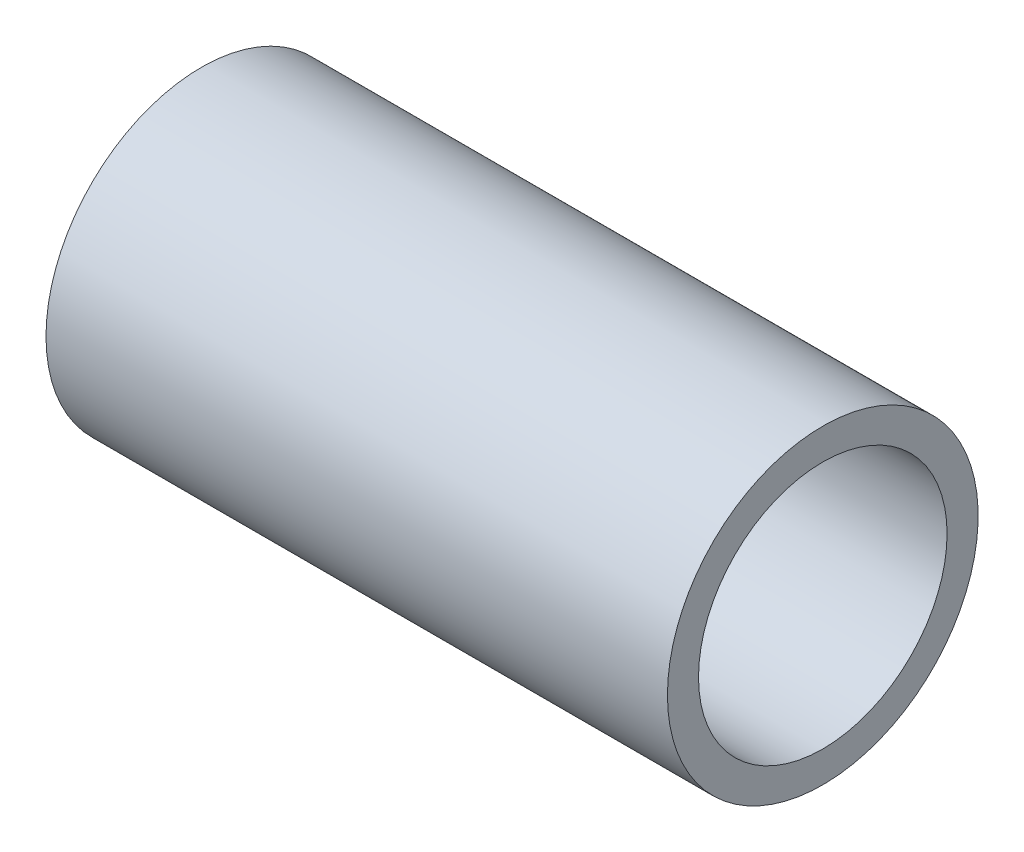
ISO-10303-21;
HEADER;
FILE_DESCRIPTION(('STEP AP214'),'2;1');
FILE_NAME('part.step','',(''),(''),'','','');
FILE_SCHEMA(('AUTOMOTIVE_DESIGN { 1 0 10303 214 1 1 1 1 }'));
ENDSEC;
DATA;
#1=APPLICATION_CONTEXT('core data for automotive mechanical design processes');
#2=APPLICATION_PROTOCOL_DEFINITION('international standard','automotive_design',2000,#1);
#3=PRODUCT_CONTEXT('',#1,'mechanical');
#4=PRODUCT('Part','Part','',(#3));
#5=PRODUCT_RELATED_PRODUCT_CATEGORY('part','',(#4));
#6=PRODUCT_DEFINITION_FORMATION('','',#4);
#7=PRODUCT_DEFINITION_CONTEXT('part definition',#1,'design');
#8=PRODUCT_DEFINITION('design','',#6,#7);
#9=PRODUCT_DEFINITION_SHAPE('','',#8);
#10=(LENGTH_UNIT() NAMED_UNIT(*) SI_UNIT(.MILLI.,.METRE.));
#11=(NAMED_UNIT(*) PLANE_ANGLE_UNIT() SI_UNIT($,.RADIAN.));
#12=(NAMED_UNIT(*) SI_UNIT($,.STERADIAN.) SOLID_ANGLE_UNIT());
#13=UNCERTAINTY_MEASURE_WITH_UNIT(LENGTH_MEASURE(1.E-05),#10,'distance_accuracy_value','');
#14=(GEOMETRIC_REPRESENTATION_CONTEXT(3) GLOBAL_UNCERTAINTY_ASSIGNED_CONTEXT((#13)) GLOBAL_UNIT_ASSIGNED_CONTEXT((#10,
#11,#12)) REPRESENTATION_CONTEXT('',''));
#15=CARTESIAN_POINT('',(0.,0.,0.));
#16=DIRECTION('',(0.,0.,1.));
#17=DIRECTION('',(1.,0.,0.));
#18=AXIS2_PLACEMENT_3D('',#15,#16,#17);
#19=CARTESIAN_POINT('',(0.,0.,0.));
#20=DIRECTION('',(-1.,0.,0.));
#21=DIRECTION('',(0.,0.,1.));
#22=AXIS2_PLACEMENT_3D('',#19,#20,#21);
#23=CYLINDRICAL_SURFACE('',#22,50.);
#24=CARTESIAN_POINT('',(0.,0.,0.));
#25=DIRECTION('',(-1.,0.,0.));
#26=DIRECTION('',(0.,0.,1.));
#27=AXIS2_PLACEMENT_3D('',#24,#25,#26);
#28=CIRCLE('',#27,50.);
#29=CARTESIAN_POINT('',(0.,0.,50.));
#30=VERTEX_POINT('',#29);
#31=EDGE_CURVE('E12',#30,#30,#28,.T.);
#32=ORIENTED_EDGE('',*,*,#31,.F.);
#33=EDGE_LOOP('',(#32));
#34=FACE_BOUND('',#33,.T.);
#35=CARTESIAN_POINT('',(200.,0.,0.));
#36=DIRECTION('',(-1.,0.,0.));
#37=DIRECTION('',(0.,0.,1.));
#38=AXIS2_PLACEMENT_3D('',#35,#36,#37);
#39=CIRCLE('',#38,50.);
#40=CARTESIAN_POINT('',(200.,0.,50.));
#41=VERTEX_POINT('',#40);
#42=EDGE_CURVE('E86',#41,#41,#39,.T.);
#43=ORIENTED_EDGE('',*,*,#42,.T.);
#44=EDGE_LOOP('',(#43));
#45=FACE_BOUND('',#44,.T.);
#46=ADVANCED_FACE('F40',(#34,#45),#23,.T.);
#47=CARTESIAN_POINT('',(0.,50.,0.));
#48=DIRECTION('',(1.,0.,0.));
#49=DIRECTION('',(0.,0.,-1.));
#50=AXIS2_PLACEMENT_3D('',#47,#48,#49);
#51=PLANE('',#50);
#52=CARTESIAN_POINT('',(0.,0.,0.));
#53=DIRECTION('',(-1.,0.,0.));
#54=DIRECTION('',(0.,0.,1.));
#55=AXIS2_PLACEMENT_3D('',#52,#53,#54);
#56=CIRCLE('',#55,32.5);
#57=CARTESIAN_POINT('',(0.,0.,32.5));
#58=VERTEX_POINT('',#57);
#59=EDGE_CURVE('E46',#58,#58,#56,.T.);
#60=ORIENTED_EDGE('',*,*,#59,.F.);
#61=EDGE_LOOP('',(#60));
#62=FACE_BOUND('',#61,.T.);
#63=ORIENTED_EDGE('',*,*,#31,.T.);
#64=EDGE_LOOP('',(#63));
#65=FACE_BOUND('',#64,.T.);
#66=ADVANCED_FACE('F159',(#62,#65),#51,.F.);
#67=CARTESIAN_POINT('',(0.,0.,0.));
#68=DIRECTION('',(-1.,0.,0.));
#69=DIRECTION('',(0.,0.,1.));
#70=AXIS2_PLACEMENT_3D('',#67,#68,#69);
#71=CYLINDRICAL_SURFACE('',#70,32.5);
#72=CARTESIAN_POINT('',(5.,0.,0.));
#73=DIRECTION('',(-1.,0.,0.));
#74=DIRECTION('',(0.,0.,1.));
#75=AXIS2_PLACEMENT_3D('',#72,#73,#74);
#76=CIRCLE('',#75,32.5);
#77=CARTESIAN_POINT('',(5.,0.,32.5));
#78=VERTEX_POINT('',#77);
#79=EDGE_CURVE('E50',#78,#78,#76,.T.);
#80=ORIENTED_EDGE('',*,*,#79,.F.);
#81=EDGE_LOOP('',(#80));
#82=FACE_BOUND('',#81,.T.);
#83=ORIENTED_EDGE('',*,*,#59,.T.);
#84=EDGE_LOOP('',(#83));
#85=FACE_BOUND('',#84,.T.);
#86=ADVANCED_FACE('F154',(#82,#85),#71,.F.);
#87=CARTESIAN_POINT('',(5.,32.5,0.));
#88=DIRECTION('',(-1.,0.,0.));
#89=DIRECTION('',(0.,0.,1.));
#90=AXIS2_PLACEMENT_3D('',#87,#88,#89);
#91=PLANE('',#90);
#92=CARTESIAN_POINT('',(5.,0.,0.));
#93=DIRECTION('',(-1.,0.,0.));
#94=DIRECTION('',(0.,0.,1.));
#95=AXIS2_PLACEMENT_3D('',#92,#93,#94);
#96=CIRCLE('',#95,34.7);
#97=CARTESIAN_POINT('',(5.,0.,34.7));
#98=VERTEX_POINT('',#97);
#99=EDGE_CURVE('E54',#98,#98,#96,.T.);
#100=ORIENTED_EDGE('',*,*,#99,.F.);
#101=EDGE_LOOP('',(#100));
#102=FACE_BOUND('',#101,.T.);
#103=ORIENTED_EDGE('',*,*,#79,.T.);
#104=EDGE_LOOP('',(#103));
#105=FACE_BOUND('',#104,.T.);
#106=ADVANCED_FACE('F148',(#102,#105),#91,.F.);
#107=CARTESIAN_POINT('',(0.,0.,0.));
#108=DIRECTION('',(-1.,0.,0.));
#109=DIRECTION('',(0.,0.,1.));
#110=AXIS2_PLACEMENT_3D('',#107,#108,#109);
#111=CYLINDRICAL_SURFACE('',#110,34.7);
#112=CARTESIAN_POINT('',(8.,0.,0.));
#113=DIRECTION('',(-1.,0.,0.));
#114=DIRECTION('',(0.,0.,1.));
#115=AXIS2_PLACEMENT_3D('',#112,#113,#114);
#116=CIRCLE('',#115,34.7);
#117=CARTESIAN_POINT('',(8.,0.,34.7));
#118=VERTEX_POINT('',#117);
#119=EDGE_CURVE('E59',#118,#118,#116,.T.);
#120=ORIENTED_EDGE('',*,*,#119,.F.);
#121=EDGE_LOOP('',(#120));
#122=FACE_BOUND('',#121,.T.);
#123=ORIENTED_EDGE('',*,*,#99,.T.);
#124=EDGE_LOOP('',(#123));
#125=FACE_BOUND('',#124,.T.);
#126=ADVANCED_FACE('F142',(#122,#125),#111,.F.);
#127=CARTESIAN_POINT('',(8.,34.7,0.));
#128=DIRECTION('',(1.,0.,0.));
#129=DIRECTION('',(0.,0.,-1.));
#130=AXIS2_PLACEMENT_3D('',#127,#128,#129);
#131=PLANE('',#130);
#132=CARTESIAN_POINT('',(8.,0.,0.));
#133=DIRECTION('',(-1.,0.,0.));
#134=DIRECTION('',(0.,0.,1.));
#135=AXIS2_PLACEMENT_3D('',#132,#133,#134);
#136=CIRCLE('',#135,32.5);
#137=CARTESIAN_POINT('',(8.,0.,32.5));
#138=VERTEX_POINT('',#137);
#139=EDGE_CURVE('E62',#138,#138,#136,.T.);
#140=ORIENTED_EDGE('',*,*,#139,.F.);
#141=EDGE_LOOP('',(#140));
#142=FACE_BOUND('',#141,.T.);
#143=ORIENTED_EDGE('',*,*,#119,.T.);
#144=EDGE_LOOP('',(#143));
#145=FACE_BOUND('',#144,.T.);
#146=ADVANCED_FACE('F136',(#142,#145),#131,.F.);
#147=CARTESIAN_POINT('',(0.,0.,0.));
#148=DIRECTION('',(-1.,0.,0.));
#149=DIRECTION('',(0.,0.,1.));
#150=AXIS2_PLACEMENT_3D('',#147,#148,#149);
#151=CYLINDRICAL_SURFACE('',#150,32.5);
#152=CARTESIAN_POINT('',(20.,0.,0.));
#153=DIRECTION('',(-1.,0.,0.));
#154=DIRECTION('',(0.,0.,1.));
#155=AXIS2_PLACEMENT_3D('',#152,#153,#154);
#156=CIRCLE('',#155,32.5);
#157=CARTESIAN_POINT('',(20.,0.,32.5));
#158=VERTEX_POINT('',#157);
#159=EDGE_CURVE('E65',#158,#158,#156,.T.);
#160=ORIENTED_EDGE('',*,*,#159,.F.);
#161=EDGE_LOOP('',(#160));
#162=FACE_BOUND('',#161,.T.);
#163=ORIENTED_EDGE('',*,*,#139,.T.);
#164=EDGE_LOOP('',(#163));
#165=FACE_BOUND('',#164,.T.);
#166=ADVANCED_FACE('F130',(#162,#165),#151,.F.);
#167=CARTESIAN_POINT('',(20.,32.5,0.));
#168=DIRECTION('',(-1.,0.,0.));
#169=DIRECTION('',(0.,0.,1.));
#170=AXIS2_PLACEMENT_3D('',#167,#168,#169);
#171=PLANE('',#170);
#172=CARTESIAN_POINT('',(20.,0.,0.));
#173=DIRECTION('',(-1.,0.,0.));
#174=DIRECTION('',(0.,0.,1.));
#175=AXIS2_PLACEMENT_3D('',#172,#173,#174);
#176=CIRCLE('',#175,34.7);
#177=CARTESIAN_POINT('',(20.,0.,34.7));
#178=VERTEX_POINT('',#177);
#179=EDGE_CURVE('E68',#178,#178,#176,.T.);
#180=ORIENTED_EDGE('',*,*,#179,.F.);
#181=EDGE_LOOP('',(#180));
#182=FACE_BOUND('',#181,.T.);
#183=ORIENTED_EDGE('',*,*,#159,.T.);
#184=EDGE_LOOP('',(#183));
#185=FACE_BOUND('',#184,.T.);
#186=ADVANCED_FACE('F124',(#182,#185),#171,.F.);
#187=CARTESIAN_POINT('',(0.,0.,0.));
#188=DIRECTION('',(-1.,0.,0.));
#189=DIRECTION('',(0.,0.,1.));
#190=AXIS2_PLACEMENT_3D('',#187,#188,#189);
#191=CYLINDRICAL_SURFACE('',#190,34.7);
#192=CARTESIAN_POINT('',(23.,0.,0.));
#193=DIRECTION('',(-1.,0.,0.));
#194=DIRECTION('',(0.,0.,1.));
#195=AXIS2_PLACEMENT_3D('',#192,#193,#194);
#196=CIRCLE('',#195,34.7);
#197=CARTESIAN_POINT('',(23.,0.,34.7));
#198=VERTEX_POINT('',#197);
#199=EDGE_CURVE('E71',#198,#198,#196,.T.);
#200=ORIENTED_EDGE('',*,*,#199,.F.);
#201=EDGE_LOOP('',(#200));
#202=FACE_BOUND('',#201,.T.);
#203=ORIENTED_EDGE('',*,*,#179,.T.);
#204=EDGE_LOOP('',(#203));
#205=FACE_BOUND('',#204,.T.);
#206=ADVANCED_FACE('F118',(#202,#205),#191,.F.);
#207=CARTESIAN_POINT('',(23.,34.7,0.));
#208=DIRECTION('',(1.,0.,0.));
#209=DIRECTION('',(0.,0.,-1.));
#210=AXIS2_PLACEMENT_3D('',#207,#208,#209);
#211=PLANE('',#210);
#212=CARTESIAN_POINT('',(23.,0.,0.));
#213=DIRECTION('',(-1.,0.,0.));
#214=DIRECTION('',(0.,0.,1.));
#215=AXIS2_PLACEMENT_3D('',#212,#213,#214);
#216=CIRCLE('',#215,32.5);
#217=CARTESIAN_POINT('',(23.,0.,32.5));
#218=VERTEX_POINT('',#217);
#219=EDGE_CURVE('E74',#218,#218,#216,.T.);
#220=ORIENTED_EDGE('',*,*,#219,.F.);
#221=EDGE_LOOP('',(#220));
#222=FACE_BOUND('',#221,.T.);
#223=ORIENTED_EDGE('',*,*,#199,.T.);
#224=EDGE_LOOP('',(#223));
#225=FACE_BOUND('',#224,.T.);
#226=ADVANCED_FACE('F112',(#222,#225),#211,.F.);
#227=CARTESIAN_POINT('',(0.,0.,0.));
#228=DIRECTION('',(-1.,0.,0.));
#229=DIRECTION('',(0.,0.,1.));
#230=AXIS2_PLACEMENT_3D('',#227,#228,#229);
#231=CYLINDRICAL_SURFACE('',#230,32.5);
#232=CARTESIAN_POINT('',(30.,0.,0.));
#233=DIRECTION('',(-1.,0.,0.));
#234=DIRECTION('',(0.,0.,1.));
#235=AXIS2_PLACEMENT_3D('',#232,#233,#234);
#236=CIRCLE('',#235,32.5);
#237=CARTESIAN_POINT('',(30.,0.,32.5));
#238=VERTEX_POINT('',#237);
#239=EDGE_CURVE('E77',#238,#238,#236,.T.);
#240=ORIENTED_EDGE('',*,*,#239,.F.);
#241=EDGE_LOOP('',(#240));
#242=FACE_BOUND('',#241,.T.);
#243=ORIENTED_EDGE('',*,*,#219,.T.);
#244=EDGE_LOOP('',(#243));
#245=FACE_BOUND('',#244,.T.);
#246=ADVANCED_FACE('F106',(#242,#245),#231,.F.);
#247=CARTESIAN_POINT('',(30.,32.5,0.));
#248=DIRECTION('',(-1.,0.,0.));
#249=DIRECTION('',(0.,0.,1.));
#250=AXIS2_PLACEMENT_3D('',#247,#248,#249);
#251=PLANE('',#250);
#252=CARTESIAN_POINT('',(30.,0.,0.));
#253=DIRECTION('',(-1.,0.,0.));
#254=DIRECTION('',(0.,0.,1.));
#255=AXIS2_PLACEMENT_3D('',#252,#253,#254);
#256=CIRCLE('',#255,40.);
#257=CARTESIAN_POINT('',(30.,0.,40.));
#258=VERTEX_POINT('',#257);
#259=EDGE_CURVE('E80',#258,#258,#256,.T.);
#260=ORIENTED_EDGE('',*,*,#259,.F.);
#261=EDGE_LOOP('',(#260));
#262=FACE_BOUND('',#261,.T.);
#263=ORIENTED_EDGE('',*,*,#239,.T.);
#264=EDGE_LOOP('',(#263));
#265=FACE_BOUND('',#264,.T.);
#266=ADVANCED_FACE('F100',(#262,#265),#251,.F.);
#267=CARTESIAN_POINT('',(0.,0.,0.));
#268=DIRECTION('',(-1.,0.,0.));
#269=DIRECTION('',(0.,0.,1.));
#270=AXIS2_PLACEMENT_3D('',#267,#268,#269);
#271=CYLINDRICAL_SURFACE('',#270,40.);
#272=CARTESIAN_POINT('',(200.,0.,0.));
#273=DIRECTION('',(-1.,0.,0.));
#274=DIRECTION('',(0.,0.,1.));
#275=AXIS2_PLACEMENT_3D('',#272,#273,#274);
#276=CIRCLE('',#275,40.);
#277=CARTESIAN_POINT('',(200.,0.,40.));
#278=VERTEX_POINT('',#277);
#279=EDGE_CURVE('E83',#278,#278,#276,.T.);
#280=ORIENTED_EDGE('',*,*,#279,.F.);
#281=EDGE_LOOP('',(#280));
#282=FACE_BOUND('',#281,.T.);
#283=ORIENTED_EDGE('',*,*,#259,.T.);
#284=EDGE_LOOP('',(#283));
#285=FACE_BOUND('',#284,.T.);
#286=ADVANCED_FACE('F94',(#282,#285),#271,.F.);
#287=CARTESIAN_POINT('',(200.,40.,0.));
#288=DIRECTION('',(-1.,0.,0.));
#289=DIRECTION('',(0.,0.,1.));
#290=AXIS2_PLACEMENT_3D('',#287,#288,#289);
#291=PLANE('',#290);
#292=ORIENTED_EDGE('',*,*,#42,.F.);
#293=EDGE_LOOP('',(#292));
#294=FACE_BOUND('',#293,.T.);
#295=ORIENTED_EDGE('',*,*,#279,.T.);
#296=EDGE_LOOP('',(#295));
#297=FACE_BOUND('',#296,.T.);
#298=ADVANCED_FACE('F91',(#294,#297),#291,.F.);
#299=CLOSED_SHELL('',(#46,#66,#86,#106,#126,#146,#166,#186,#206,#226,#246,#266,#286,#298));
#300=MANIFOLD_SOLID_BREP('B2',#299);
#301=ADVANCED_BREP_SHAPE_REPRESENTATION('',(#18,#300),#14);
#302=SHAPE_DEFINITION_REPRESENTATION(#9,#301);
ENDSEC;
END-ISO-10303-21;
